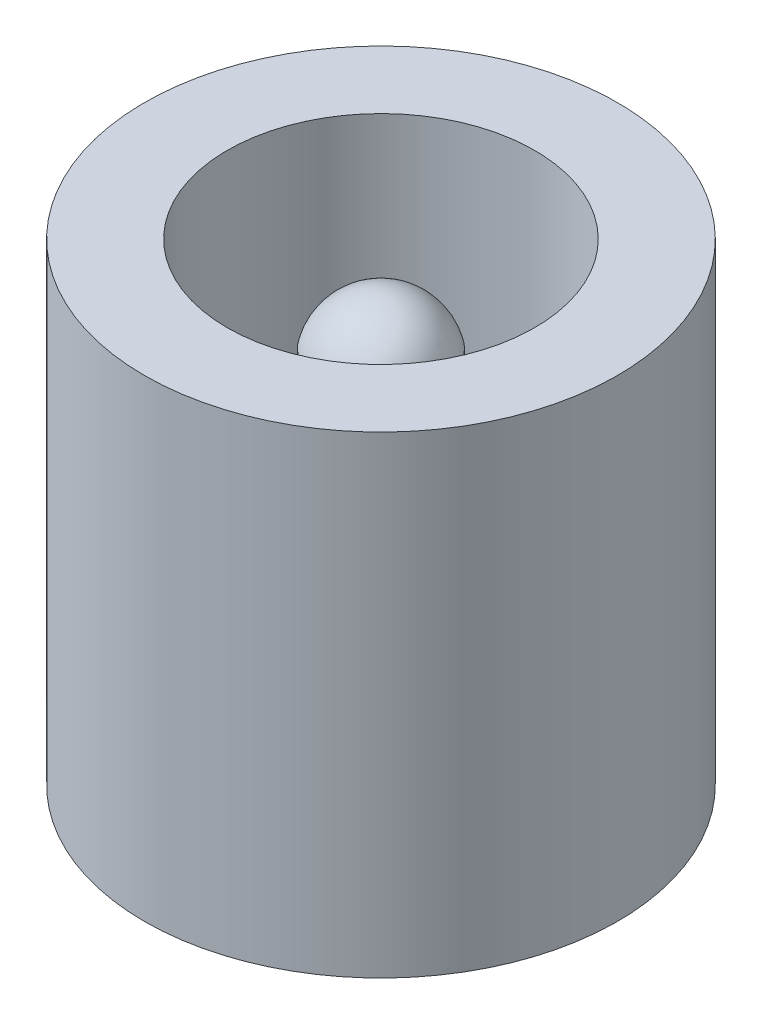
ISO-10303-21;
HEADER;
FILE_DESCRIPTION(('STEP AP214'),'2;1');
FILE_NAME('part.step','',(''),(''),'','','');
FILE_SCHEMA(('AUTOMOTIVE_DESIGN { 1 0 10303 214 1 1 1 1 }'));
ENDSEC;
DATA;
#1=APPLICATION_CONTEXT('core data for automotive mechanical design processes');
#2=APPLICATION_PROTOCOL_DEFINITION('international standard','automotive_design',2000,#1);
#3=PRODUCT_CONTEXT('',#1,'mechanical');
#4=PRODUCT('Part','Part','',(#3));
#5=PRODUCT_RELATED_PRODUCT_CATEGORY('part','',(#4));
#6=PRODUCT_DEFINITION_FORMATION('','',#4);
#7=PRODUCT_DEFINITION_CONTEXT('part definition',#1,'design');
#8=PRODUCT_DEFINITION('design','',#6,#7);
#9=PRODUCT_DEFINITION_SHAPE('','',#8);
#10=(LENGTH_UNIT() NAMED_UNIT(*) SI_UNIT(.MILLI.,.METRE.));
#11=(NAMED_UNIT(*) PLANE_ANGLE_UNIT() SI_UNIT($,.RADIAN.));
#12=(NAMED_UNIT(*) SI_UNIT($,.STERADIAN.) SOLID_ANGLE_UNIT());
#13=UNCERTAINTY_MEASURE_WITH_UNIT(LENGTH_MEASURE(1.E-05),#10,'distance_accuracy_value','');
#14=(GEOMETRIC_REPRESENTATION_CONTEXT(3) GLOBAL_UNCERTAINTY_ASSIGNED_CONTEXT((#13)) GLOBAL_UNIT_ASSIGNED_CONTEXT((#10,
#11,#12)) REPRESENTATION_CONTEXT('',''));
#15=CARTESIAN_POINT('',(0.,0.,0.));
#16=DIRECTION('',(0.,0.,1.));
#17=DIRECTION('',(1.,0.,0.));
#18=AXIS2_PLACEMENT_3D('',#15,#16,#17);
#19=CARTESIAN_POINT('',(0.,2.,0.));
#20=DIRECTION('',(0.,1.,0.));
#21=DIRECTION('',(0.,0.,1.));
#22=AXIS2_PLACEMENT_3D('',#19,#20,#21);
#23=PLANE('',#22);
#24=CARTESIAN_POINT('',(0.,2.,0.));
#25=DIRECTION('',(0.,1.,0.));
#26=DIRECTION('',(0.,0.,1.));
#27=AXIS2_PLACEMENT_3D('',#24,#25,#26);
#28=CIRCLE('',#27,3.25);
#29=CARTESIAN_POINT('',(0.,2.,3.25));
#30=VERTEX_POINT('',#29);
#31=EDGE_CURVE('E45',#30,#30,#28,.T.);
#32=ORIENTED_EDGE('',*,*,#31,.T.);
#33=EDGE_LOOP('',(#32));
#34=FACE_BOUND('',#33,.T.);
#35=CARTESIAN_POINT('',(0.,2.,0.));
#36=DIRECTION('',(0.,1.,0.));
#37=DIRECTION('',(0.,0.,1.));
#38=AXIS2_PLACEMENT_3D('',#35,#36,#37);
#39=CIRCLE('',#38,1.25);
#40=CARTESIAN_POINT('',(0.,2.,1.25));
#41=VERTEX_POINT('',#40);
#42=EDGE_CURVE('E52',#41,#41,#39,.T.);
#43=ORIENTED_EDGE('',*,*,#42,.F.);
#44=EDGE_LOOP('',(#43));
#45=FACE_BOUND('',#44,.T.);
#46=ADVANCED_FACE('F32',(#34,#45),#23,.T.);
#47=CARTESIAN_POINT('',(0.,10.,0.));
#48=DIRECTION('',(0.,-1.,0.));
#49=DIRECTION('',(0.,0.,-1.));
#50=AXIS2_PLACEMENT_3D('',#47,#48,#49);
#51=CYLINDRICAL_SURFACE('',#50,5.);
#52=CARTESIAN_POINT('',(0.,10.,0.));
#53=DIRECTION('',(0.,1.,0.));
#54=DIRECTION('',(0.,0.,1.));
#55=AXIS2_PLACEMENT_3D('',#52,#53,#54);
#56=CIRCLE('',#55,5.);
#57=CARTESIAN_POINT('',(0.,10.,5.));
#58=VERTEX_POINT('',#57);
#59=EDGE_CURVE('E10',#58,#58,#56,.T.);
#60=ORIENTED_EDGE('',*,*,#59,.F.);
#61=EDGE_LOOP('',(#60));
#62=FACE_BOUND('',#61,.T.);
#63=CARTESIAN_POINT('',(0.,0.,0.));
#64=DIRECTION('',(0.,1.,0.));
#65=DIRECTION('',(0.,0.,1.));
#66=AXIS2_PLACEMENT_3D('',#63,#64,#65);
#67=CIRCLE('',#66,5.);
#68=CARTESIAN_POINT('',(0.,0.,5.));
#69=VERTEX_POINT('',#68);
#70=EDGE_CURVE('E40',#69,#69,#67,.T.);
#71=ORIENTED_EDGE('',*,*,#70,.T.);
#72=EDGE_LOOP('',(#71));
#73=FACE_BOUND('',#72,.T.);
#74=ADVANCED_FACE('F73',(#62,#73),#51,.T.);
#75=CARTESIAN_POINT('',(0.,10.,0.));
#76=DIRECTION('',(0.,1.,0.));
#77=DIRECTION('',(0.,0.,1.));
#78=AXIS2_PLACEMENT_3D('',#75,#76,#77);
#79=PLANE('',#78);
#80=CARTESIAN_POINT('',(0.,10.,0.));
#81=DIRECTION('',(0.,1.,0.));
#82=DIRECTION('',(0.,0.,1.));
#83=AXIS2_PLACEMENT_3D('',#80,#81,#82);
#84=CIRCLE('',#83,3.25);
#85=CARTESIAN_POINT('',(0.,10.,3.25));
#86=VERTEX_POINT('',#85);
#87=EDGE_CURVE('E47',#86,#86,#84,.T.);
#88=ORIENTED_EDGE('',*,*,#87,.F.);
#89=EDGE_LOOP('',(#88));
#90=FACE_BOUND('',#89,.T.);
#91=ORIENTED_EDGE('',*,*,#59,.T.);
#92=EDGE_LOOP('',(#91));
#93=FACE_BOUND('',#92,.T.);
#94=ADVANCED_FACE('F78',(#90,#93),#79,.T.);
#95=CARTESIAN_POINT('',(0.,0.,0.));
#96=DIRECTION('',(0.,1.,0.));
#97=DIRECTION('',(0.,0.,1.));
#98=AXIS2_PLACEMENT_3D('',#95,#96,#97);
#99=PLANE('',#98);
#100=ORIENTED_EDGE('',*,*,#70,.F.);
#101=EDGE_LOOP('',(#100));
#102=FACE_BOUND('',#101,.T.);
#103=ADVANCED_FACE('F68',(#102),#99,.F.);
#104=CARTESIAN_POINT('',(0.,2.,0.));
#105=DIRECTION('',(0.,1.,0.));
#106=DIRECTION('',(0.,0.,1.));
#107=AXIS2_PLACEMENT_3D('',#104,#105,#106);
#108=CYLINDRICAL_SURFACE('',#107,3.25);
#109=ORIENTED_EDGE('',*,*,#31,.F.);
#110=EDGE_LOOP('',(#109));
#111=FACE_BOUND('',#110,.T.);
#112=ORIENTED_EDGE('',*,*,#87,.T.);
#113=EDGE_LOOP('',(#112));
#114=FACE_BOUND('',#113,.T.);
#115=ADVANCED_FACE('F62',(#111,#114),#108,.F.);
#116=CARTESIAN_POINT('',(0.,8.,0.));
#117=DIRECTION('',(0.,-1.,0.));
#118=DIRECTION('',(0.,0.,-1.));
#119=AXIS2_PLACEMENT_3D('',#116,#117,#118);
#120=CYLINDRICAL_SURFACE('',#119,1.25);
#121=CARTESIAN_POINT('',(0.,8.,0.));
#122=DIRECTION('',(0.,1.,0.));
#123=DIRECTION('',(0.,0.,1.));
#124=AXIS2_PLACEMENT_3D('',#121,#122,#123);
#125=CIRCLE('',#124,1.25);
#126=CARTESIAN_POINT('',(0.,8.,1.25));
#127=VERTEX_POINT('',#126);
#128=EDGE_CURVE('E36',#127,#127,#125,.T.);
#129=ORIENTED_EDGE('',*,*,#128,.F.);
#130=EDGE_LOOP('',(#129));
#131=FACE_BOUND('',#130,.T.);
#132=ORIENTED_EDGE('',*,*,#42,.T.);
#133=EDGE_LOOP('',(#132));
#134=FACE_BOUND('',#133,.T.);
#135=ADVANCED_FACE('F60',(#131,#134),#120,.T.);
#136=CARTESIAN_POINT('',(0.,7.71875,0.));
#137=DIRECTION('',(0.,0.,1.));
#138=DIRECTION('',(1.,0.,0.));
#139=AXIS2_PLACEMENT_3D('',#136,#137,#138);
#140=SPHERICAL_SURFACE('',#139,1.28125);
#141=CARTESIAN_POINT('',(0.,7.71875,0.));
#142=DIRECTION('',(0.,1.,0.));
#143=DIRECTION('',(0.,0.,1.));
#144=AXIS2_PLACEMENT_3D('',#141,#142,#143);
#145=SPHERICAL_SURFACE('',#144,1.28125);
#146=ORIENTED_EDGE('',*,*,#128,.T.);
#147=EDGE_LOOP('',(#146));
#148=FACE_BOUND('',#147,.T.);
#149=ADVANCED_FACE('F34',(#148),#145,.T.);
#150=CLOSED_SHELL('',(#46,#74,#94,#103,#115,#135,#149));
#151=MANIFOLD_SOLID_BREP('B2',#150);
#152=ADVANCED_BREP_SHAPE_REPRESENTATION('',(#18,#151),#14);
#153=SHAPE_DEFINITION_REPRESENTATION(#9,#152);
ENDSEC;
END-ISO-10303-21;
